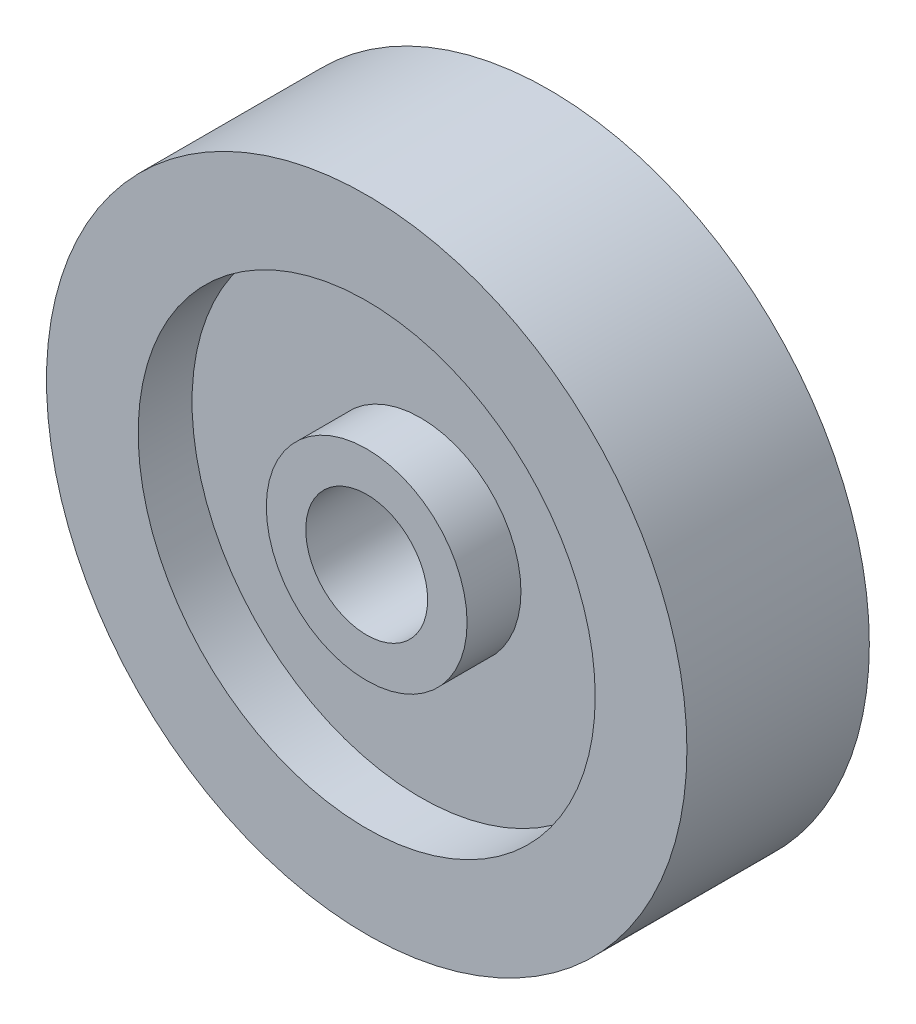
ISO-10303-21;
HEADER;
FILE_DESCRIPTION(('STEP AP214'),'2;1');
FILE_NAME('part.step','',(''),(''),'','','');
FILE_SCHEMA(('AUTOMOTIVE_DESIGN { 1 0 10303 214 1 1 1 1 }'));
ENDSEC;
DATA;
#1=APPLICATION_CONTEXT('core data for automotive mechanical design processes');
#2=APPLICATION_PROTOCOL_DEFINITION('international standard','automotive_design',2000,#1);
#3=PRODUCT_CONTEXT('',#1,'mechanical');
#4=PRODUCT('Part','Part','',(#3));
#5=PRODUCT_RELATED_PRODUCT_CATEGORY('part','',(#4));
#6=PRODUCT_DEFINITION_FORMATION('','',#4);
#7=PRODUCT_DEFINITION_CONTEXT('part definition',#1,'design');
#8=PRODUCT_DEFINITION('design','',#6,#7);
#9=PRODUCT_DEFINITION_SHAPE('','',#8);
#10=(LENGTH_UNIT() NAMED_UNIT(*) SI_UNIT(.MILLI.,.METRE.));
#11=(NAMED_UNIT(*) PLANE_ANGLE_UNIT() SI_UNIT($,.RADIAN.));
#12=(NAMED_UNIT(*) SI_UNIT($,.STERADIAN.) SOLID_ANGLE_UNIT());
#13=UNCERTAINTY_MEASURE_WITH_UNIT(LENGTH_MEASURE(1.E-05),#10,'distance_accuracy_value','');
#14=(GEOMETRIC_REPRESENTATION_CONTEXT(3) GLOBAL_UNCERTAINTY_ASSIGNED_CONTEXT((#13)) GLOBAL_UNIT_ASSIGNED_CONTEXT((#10,
#11,#12)) REPRESENTATION_CONTEXT('',''));
#15=CARTESIAN_POINT('',(0.,0.,0.));
#16=DIRECTION('',(0.,0.,1.));
#17=DIRECTION('',(1.,0.,0.));
#18=AXIS2_PLACEMENT_3D('',#15,#16,#17);
#19=CARTESIAN_POINT('',(0.,0.,-2.794));
#20=DIRECTION('',(0.,0.,1.));
#21=DIRECTION('',(1.,0.,0.));
#22=AXIS2_PLACEMENT_3D('',#19,#20,#21);
#23=PLANE('',#22);
#24=CARTESIAN_POINT('',(0.,0.,-2.794));
#25=DIRECTION('',(0.,0.,1.));
#26=DIRECTION('',(1.,0.,0.));
#27=AXIS2_PLACEMENT_3D('',#24,#25,#26);
#28=CIRCLE('',#27,1.8669);
#29=CARTESIAN_POINT('',(1.8669,0.,-2.794));
#30=VERTEX_POINT('',#29);
#31=EDGE_CURVE('E58',#30,#30,#28,.T.);
#32=ORIENTED_EDGE('',*,*,#31,.T.);
#33=EDGE_LOOP('',(#32));
#34=FACE_BOUND('',#33,.T.);
#35=CARTESIAN_POINT('',(0.,0.,-2.794));
#36=DIRECTION('',(0.,0.,1.));
#37=DIRECTION('',(1.,0.,0.));
#38=AXIS2_PLACEMENT_3D('',#35,#36,#37);
#39=CIRCLE('',#38,3.075);
#40=CARTESIAN_POINT('',(3.075,0.,-2.794));
#41=VERTEX_POINT('',#40);
#42=EDGE_CURVE('E90',#41,#41,#39,.T.);
#43=ORIENTED_EDGE('',*,*,#42,.F.);
#44=EDGE_LOOP('',(#43));
#45=FACE_BOUND('',#44,.T.);
#46=ADVANCED_FACE('F43',(#34,#45),#23,.F.);
#47=CARTESIAN_POINT('',(0.,0.,2.794));
#48=DIRECTION('',(0.,0.,1.));
#49=DIRECTION('',(1.,0.,0.));
#50=AXIS2_PLACEMENT_3D('',#47,#48,#49);
#51=PLANE('',#50);
#52=CARTESIAN_POINT('',(0.,0.,2.794));
#53=DIRECTION('',(0.,0.,1.));
#54=DIRECTION('',(1.,0.,0.));
#55=AXIS2_PLACEMENT_3D('',#52,#53,#54);
#56=CIRCLE('',#55,1.8669);
#57=CARTESIAN_POINT('',(1.8669,0.,2.794));
#58=VERTEX_POINT('',#57);
#59=EDGE_CURVE('E56',#58,#58,#56,.T.);
#60=ORIENTED_EDGE('',*,*,#59,.F.);
#61=EDGE_LOOP('',(#60));
#62=FACE_BOUND('',#61,.T.);
#63=CARTESIAN_POINT('',(0.,0.,2.794));
#64=DIRECTION('',(0.,0.,1.));
#65=DIRECTION('',(1.,0.,0.));
#66=AXIS2_PLACEMENT_3D('',#63,#64,#65);
#67=CIRCLE('',#66,3.075);
#68=CARTESIAN_POINT('',(3.075,0.,2.794));
#69=VERTEX_POINT('',#68);
#70=EDGE_CURVE('E74',#69,#69,#67,.T.);
#71=ORIENTED_EDGE('',*,*,#70,.T.);
#72=EDGE_LOOP('',(#71));
#73=FACE_BOUND('',#72,.T.);
#74=ADVANCED_FACE('F108',(#62,#73),#51,.T.);
#75=CARTESIAN_POINT('',(0.,0.,2.794));
#76=DIRECTION('',(0.,0.,1.));
#77=DIRECTION('',(1.,0.,0.));
#78=AXIS2_PLACEMENT_3D('',#75,#76,#77);
#79=CIRCLE('',#78,7.);
#80=CARTESIAN_POINT('',(7.,0.,2.794));
#81=VERTEX_POINT('',#80);
#82=EDGE_CURVE('E66',#81,#81,#79,.T.);
#83=ORIENTED_EDGE('',*,*,#82,.F.);
#84=EDGE_LOOP('',(#83));
#85=FACE_BOUND('',#84,.T.);
#86=CARTESIAN_POINT('',(0.,0.,2.794));
#87=DIRECTION('',(0.,0.,1.));
#88=DIRECTION('',(1.,0.,0.));
#89=AXIS2_PLACEMENT_3D('',#86,#87,#88);
#90=CIRCLE('',#89,9.80909091);
#91=CARTESIAN_POINT('',(9.80909091,0.,2.794));
#92=VERTEX_POINT('',#91);
#93=EDGE_CURVE('E10',#92,#92,#90,.T.);
#94=ORIENTED_EDGE('',*,*,#93,.T.);
#95=EDGE_LOOP('',(#94));
#96=FACE_BOUND('',#95,.T.);
#97=ADVANCED_FACE('F116',(#85,#96),#51,.T.);
#98=CARTESIAN_POINT('',(0.,0.,-2.794));
#99=DIRECTION('',(0.,0.,1.));
#100=DIRECTION('',(1.,0.,0.));
#101=AXIS2_PLACEMENT_3D('',#98,#99,#100);
#102=CIRCLE('',#101,7.);
#103=CARTESIAN_POINT('',(7.,0.,-2.794));
#104=VERTEX_POINT('',#103);
#105=EDGE_CURVE('E82',#104,#104,#102,.T.);
#106=ORIENTED_EDGE('',*,*,#105,.T.);
#107=EDGE_LOOP('',(#106));
#108=FACE_BOUND('',#107,.T.);
#109=CARTESIAN_POINT('',(0.,0.,-2.794));
#110=DIRECTION('',(0.,0.,1.));
#111=DIRECTION('',(1.,0.,0.));
#112=AXIS2_PLACEMENT_3D('',#109,#110,#111);
#113=CIRCLE('',#112,9.80909091);
#114=CARTESIAN_POINT('',(9.80909091,0.,-2.794));
#115=VERTEX_POINT('',#114);
#116=EDGE_CURVE('E47',#115,#115,#113,.T.);
#117=ORIENTED_EDGE('',*,*,#116,.F.);
#118=EDGE_LOOP('',(#117));
#119=FACE_BOUND('',#118,.T.);
#120=ADVANCED_FACE('F110',(#108,#119),#23,.F.);
#121=CARTESIAN_POINT('',(0.,0.,2.794));
#122=DIRECTION('',(0.,0.,-1.));
#123=DIRECTION('',(-1.,0.,0.));
#124=AXIS2_PLACEMENT_3D('',#121,#122,#123);
#125=CYLINDRICAL_SURFACE('',#124,9.80909091);
#126=ORIENTED_EDGE('',*,*,#93,.F.);
#127=EDGE_LOOP('',(#126));
#128=FACE_BOUND('',#127,.T.);
#129=ORIENTED_EDGE('',*,*,#116,.T.);
#130=EDGE_LOOP('',(#129));
#131=FACE_BOUND('',#130,.T.);
#132=ADVANCED_FACE('F45',(#128,#131),#125,.T.);
#133=CARTESIAN_POINT('',(0.,0.,2.794));
#134=DIRECTION('',(0.,0.,-1.));
#135=DIRECTION('',(-1.,0.,0.));
#136=AXIS2_PLACEMENT_3D('',#133,#134,#135);
#137=CYLINDRICAL_SURFACE('',#136,1.8669);
#138=ORIENTED_EDGE('',*,*,#59,.T.);
#139=EDGE_LOOP('',(#138));
#140=FACE_BOUND('',#139,.T.);
#141=ORIENTED_EDGE('',*,*,#31,.F.);
#142=EDGE_LOOP('',(#141));
#143=FACE_BOUND('',#142,.T.);
#144=ADVANCED_FACE('F124',(#140,#143),#137,.F.);
#145=CARTESIAN_POINT('',(0.,0.,1.144));
#146=DIRECTION('',(0.,0.,1.));
#147=DIRECTION('',(1.,0.,0.));
#148=AXIS2_PLACEMENT_3D('',#145,#146,#147);
#149=CYLINDRICAL_SURFACE('',#148,7.);
#150=CARTESIAN_POINT('',(0.,0.,1.144));
#151=DIRECTION('',(0.,0.,1.));
#152=DIRECTION('',(1.,0.,0.));
#153=AXIS2_PLACEMENT_3D('',#150,#151,#152);
#154=CIRCLE('',#153,7.);
#155=CARTESIAN_POINT('',(7.,0.,1.144));
#156=VERTEX_POINT('',#155);
#157=EDGE_CURVE('E62',#156,#156,#154,.T.);
#158=ORIENTED_EDGE('',*,*,#157,.F.);
#159=EDGE_LOOP('',(#158));
#160=FACE_BOUND('',#159,.T.);
#161=ORIENTED_EDGE('',*,*,#82,.T.);
#162=EDGE_LOOP('',(#161));
#163=FACE_BOUND('',#162,.T.);
#164=ADVANCED_FACE('F147',(#160,#163),#149,.F.);
#165=CARTESIAN_POINT('',(0.,0.,1.144));
#166=DIRECTION('',(0.,0.,1.));
#167=DIRECTION('',(1.,0.,0.));
#168=AXIS2_PLACEMENT_3D('',#165,#166,#167);
#169=PLANE('',#168);
#170=CARTESIAN_POINT('',(0.,0.,1.144));
#171=DIRECTION('',(0.,0.,1.));
#172=DIRECTION('',(1.,0.,0.));
#173=AXIS2_PLACEMENT_3D('',#170,#171,#172);
#174=CIRCLE('',#173,3.075);
#175=CARTESIAN_POINT('',(3.075,0.,1.144));
#176=VERTEX_POINT('',#175);
#177=EDGE_CURVE('E70',#176,#176,#174,.T.);
#178=ORIENTED_EDGE('',*,*,#177,.F.);
#179=EDGE_LOOP('',(#178));
#180=FACE_BOUND('',#179,.T.);
#181=ORIENTED_EDGE('',*,*,#157,.T.);
#182=EDGE_LOOP('',(#181));
#183=FACE_BOUND('',#182,.T.);
#184=ADVANCED_FACE('F143',(#180,#183),#169,.T.);
#185=CARTESIAN_POINT('',(0.,0.,1.144));
#186=DIRECTION('',(0.,0.,1.));
#187=DIRECTION('',(1.,0.,0.));
#188=AXIS2_PLACEMENT_3D('',#185,#186,#187);
#189=CYLINDRICAL_SURFACE('',#188,3.075);
#190=ORIENTED_EDGE('',*,*,#177,.T.);
#191=EDGE_LOOP('',(#190));
#192=FACE_BOUND('',#191,.T.);
#193=ORIENTED_EDGE('',*,*,#70,.F.);
#194=EDGE_LOOP('',(#193));
#195=FACE_BOUND('',#194,.T.);
#196=ADVANCED_FACE('F138',(#192,#195),#189,.T.);
#197=CARTESIAN_POINT('',(0.,0.,-1.144));
#198=DIRECTION('',(0.,0.,-1.));
#199=DIRECTION('',(1.,0.,0.));
#200=AXIS2_PLACEMENT_3D('',#197,#198,#199);
#201=PLANE('',#200);
#202=CARTESIAN_POINT('',(0.,0.,-1.144));
#203=DIRECTION('',(0.,0.,1.));
#204=DIRECTION('',(1.,0.,0.));
#205=AXIS2_PLACEMENT_3D('',#202,#203,#204);
#206=CIRCLE('',#205,7.);
#207=CARTESIAN_POINT('',(7.,0.,-1.144));
#208=VERTEX_POINT('',#207);
#209=EDGE_CURVE('E78',#208,#208,#206,.T.);
#210=ORIENTED_EDGE('',*,*,#209,.F.);
#211=EDGE_LOOP('',(#210));
#212=FACE_BOUND('',#211,.T.);
#213=CARTESIAN_POINT('',(0.,0.,-1.144));
#214=DIRECTION('',(0.,0.,1.));
#215=DIRECTION('',(1.,0.,0.));
#216=AXIS2_PLACEMENT_3D('',#213,#214,#215);
#217=CIRCLE('',#216,3.075);
#218=CARTESIAN_POINT('',(3.075,0.,-1.144));
#219=VERTEX_POINT('',#218);
#220=EDGE_CURVE('E86',#219,#219,#217,.T.);
#221=ORIENTED_EDGE('',*,*,#220,.T.);
#222=EDGE_LOOP('',(#221));
#223=FACE_BOUND('',#222,.T.);
#224=ADVANCED_FACE('F98',(#212,#223),#201,.T.);
#225=CARTESIAN_POINT('',(0.,0.,-1.144));
#226=DIRECTION('',(0.,0.,-1.));
#227=DIRECTION('',(-1.,0.,0.));
#228=AXIS2_PLACEMENT_3D('',#225,#226,#227);
#229=CYLINDRICAL_SURFACE('',#228,7.);
#230=ORIENTED_EDGE('',*,*,#209,.T.);
#231=EDGE_LOOP('',(#230));
#232=FACE_BOUND('',#231,.T.);
#233=ORIENTED_EDGE('',*,*,#105,.F.);
#234=EDGE_LOOP('',(#233));
#235=FACE_BOUND('',#234,.T.);
#236=ADVANCED_FACE('F103',(#232,#235),#229,.F.);
#237=CARTESIAN_POINT('',(0.,0.,-1.144));
#238=DIRECTION('',(0.,0.,-1.));
#239=DIRECTION('',(-1.,0.,0.));
#240=AXIS2_PLACEMENT_3D('',#237,#238,#239);
#241=CYLINDRICAL_SURFACE('',#240,3.075);
#242=ORIENTED_EDGE('',*,*,#220,.F.);
#243=EDGE_LOOP('',(#242));
#244=FACE_BOUND('',#243,.T.);
#245=ORIENTED_EDGE('',*,*,#42,.T.);
#246=EDGE_LOOP('',(#245));
#247=FACE_BOUND('',#246,.T.);
#248=ADVANCED_FACE('F100',(#244,#247),#241,.T.);
#249=CLOSED_SHELL('',(#46,#74,#97,#120,#132,#144,#164,#184,#196,#224,#236,#248));
#250=MANIFOLD_SOLID_BREP('B2',#249);
#251=ADVANCED_BREP_SHAPE_REPRESENTATION('',(#18,#250),#14);
#252=SHAPE_DEFINITION_REPRESENTATION(#9,#251);
ENDSEC;
END-ISO-10303-21;
